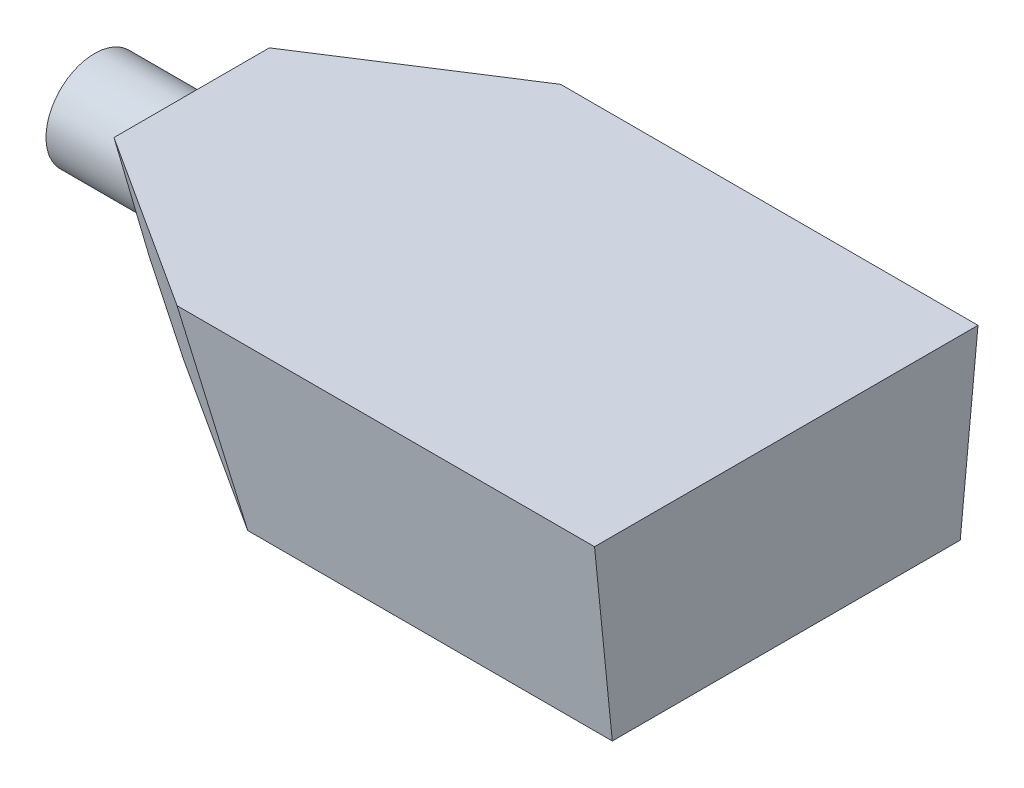
ISO-10303-21;
HEADER;
FILE_DESCRIPTION(('STEP AP214'),'2;1');
FILE_NAME('part.step','',(''),(''),'','','');
FILE_SCHEMA(('AUTOMOTIVE_DESIGN { 1 0 10303 214 1 1 1 1 }'));
ENDSEC;
DATA;
#1=APPLICATION_CONTEXT('core data for automotive mechanical design processes');
#2=APPLICATION_PROTOCOL_DEFINITION('international standard','automotive_design',2000,#1);
#3=PRODUCT_CONTEXT('',#1,'mechanical');
#4=PRODUCT('Part','Part','',(#3));
#5=PRODUCT_RELATED_PRODUCT_CATEGORY('part','',(#4));
#6=PRODUCT_DEFINITION_FORMATION('','',#4);
#7=PRODUCT_DEFINITION_CONTEXT('part definition',#1,'design');
#8=PRODUCT_DEFINITION('design','',#6,#7);
#9=PRODUCT_DEFINITION_SHAPE('','',#8);
#10=(LENGTH_UNIT() NAMED_UNIT(*) SI_UNIT(.MILLI.,.METRE.));
#11=(NAMED_UNIT(*) PLANE_ANGLE_UNIT() SI_UNIT($,.RADIAN.));
#12=(NAMED_UNIT(*) SI_UNIT($,.STERADIAN.) SOLID_ANGLE_UNIT());
#13=UNCERTAINTY_MEASURE_WITH_UNIT(LENGTH_MEASURE(1.E-05),#10,'distance_accuracy_value','');
#14=(GEOMETRIC_REPRESENTATION_CONTEXT(3) GLOBAL_UNCERTAINTY_ASSIGNED_CONTEXT((#13)) GLOBAL_UNIT_ASSIGNED_CONTEXT((#10,
#11,#12)) REPRESENTATION_CONTEXT('',''));
#15=CARTESIAN_POINT('',(0.,0.,0.));
#16=DIRECTION('',(0.,0.,1.));
#17=DIRECTION('',(1.,0.,0.));
#18=AXIS2_PLACEMENT_3D('',#15,#16,#17);
#19=CARTESIAN_POINT('',(-79.5,36.5,0.));
#20=DIRECTION('',(1.,0.,0.));
#21=DIRECTION('',(0.,0.,-1.));
#22=AXIS2_PLACEMENT_3D('',#19,#20,#21);
#23=PLANE('',#22);
#24=CARTESIAN_POINT('',(-79.5,23.5,0.));
#25=DIRECTION('',(-1.,0.,0.));
#26=DIRECTION('',(0.,0.,1.));
#27=AXIS2_PLACEMENT_3D('',#24,#25,#26);
#28=CIRCLE('',#27,10.);
#29=CARTESIAN_POINT('',(-79.5,23.5,10.));
#30=VERTEX_POINT('',#29);
#31=EDGE_CURVE('E11',#30,#30,#28,.T.);
#32=ORIENTED_EDGE('',*,*,#31,.F.);
#33=EDGE_LOOP('',(#32));
#34=FACE_BOUND('',#33,.T.);
#35=DIRECTION('',(0.,0.804868285259816,-0.593453488811822));
#36=VECTOR('',#35,1.);
#37=CARTESIAN_POINT('',(-79.5,23.5461292389051,-17.5686215407282));
#38=LINE('',#37,#36);
#39=CARTESIAN_POINT('',(-79.5,6.50000000000001,-5.00000000000007));
#40=VERTEX_POINT('',#39);
#41=CARTESIAN_POINT('',(-79.5,11.4999999999999,-8.6866497269193));
#42=VERTEX_POINT('',#41);
#43=EDGE_CURVE('E56',#40,#42,#38,.T.);
#44=ORIENTED_EDGE('',*,*,#43,.F.);
#45=DIRECTION('',(0.,0.,-1.));
#46=VECTOR('',#45,1.);
#47=CARTESIAN_POINT('',(-79.5,6.5,0.));
#48=LINE('',#47,#46);
#49=CARTESIAN_POINT('',(-79.5,6.5,5.00000000000008));
#50=VERTEX_POINT('',#49);
#51=EDGE_CURVE('E118',#50,#40,#48,.T.);
#52=ORIENTED_EDGE('',*,*,#51,.F.);
#53=DIRECTION('',(0.,-0.804868285259815,-0.593453488811823));
#54=VECTOR('',#53,1.);
#55=CARTESIAN_POINT('',(-79.5,23.5461292389051,17.5686215407283));
#56=LINE('',#55,#54);
#57=CARTESIAN_POINT('',(-79.5,11.4999999999999,8.6866497269193));
#58=VERTEX_POINT('',#57);
#59=EDGE_CURVE('E64',#58,#50,#56,.T.);
#60=ORIENTED_EDGE('',*,*,#59,.F.);
#61=DIRECTION('',(0.,0.959775929235968,0.280767102166964));
#62=VECTOR('',#61,1.);
#63=CARTESIAN_POINT('',(-79.5,32.188423897901,14.7387173494522));
#64=LINE('',#63,#62);
#65=CARTESIAN_POINT('',(-79.5,36.5,16.));
#66=VERTEX_POINT('',#65);
#67=EDGE_CURVE('E147',#58,#66,#64,.T.);
#68=ORIENTED_EDGE('',*,*,#67,.T.);
#69=DIRECTION('',(0.,0.,1.));
#70=VECTOR('',#69,1.);
#71=CARTESIAN_POINT('',(-79.5,36.5,0.));
#72=LINE('',#71,#70);
#73=CARTESIAN_POINT('',(-79.5,36.5,-16.));
#74=VERTEX_POINT('',#73);
#75=EDGE_CURVE('E150',#74,#66,#72,.T.);
#76=ORIENTED_EDGE('',*,*,#75,.F.);
#77=DIRECTION('',(0.,-0.959775929235968,0.280767102166964));
#78=VECTOR('',#77,1.);
#79=CARTESIAN_POINT('',(-79.5,32.188423897901,-14.7387173494522));
#80=LINE('',#79,#78);
#81=EDGE_CURVE('E136',#74,#42,#80,.T.);
#82=ORIENTED_EDGE('',*,*,#81,.T.);
#83=EDGE_LOOP('',(#44,#52,#60,#68,#76,#82));
#84=FACE_BOUND('',#83,.T.);
#85=ADVANCED_FACE('F41',(#34,#84),#23,.F.);
#86=CARTESIAN_POINT('',(-18.267826798414,-30.3526968342879,0.));
#87=DIRECTION('',(-0.515661935203639,-0.8567921384922,0.));
#88=DIRECTION('',(0.8567921384922,-0.515661935203639,0.));
#89=AXIS2_PLACEMENT_3D('',#86,#87,#88);
#90=PLANE('',#89);
#91=ORIENTED_EDGE('',*,*,#51,.T.);
#92=DIRECTION('',(0.742046015709188,-0.446601768713863,-0.499914563452365));
#93=VECTOR('',#92,1.);
#94=CARTESIAN_POINT('',(-35.4254371303105,-20.0263572826835,-34.6929238752086));
#95=LINE('',#94,#93);
#96=CARTESIAN_POINT('',(-68.7000000000001,0.,-12.2759332588364));
#97=VERTEX_POINT('',#96);
#98=EDGE_CURVE('E105',#40,#97,#95,.T.);
#99=ORIENTED_EDGE('',*,*,#98,.T.);
#100=DIRECTION('',(0.,0.,1.));
#101=VECTOR('',#100,1.);
#102=CARTESIAN_POINT('',(-68.7,0.,0.));
#103=LINE('',#102,#101);
#104=CARTESIAN_POINT('',(-68.7,0.,12.2759332588365));
#105=VERTEX_POINT('',#104);
#106=EDGE_CURVE('E115',#97,#105,#103,.T.);
#107=ORIENTED_EDGE('',*,*,#106,.T.);
#108=DIRECTION('',(-0.742046015709188,0.446601768713863,-0.499914563452365));
#109=VECTOR('',#108,1.);
#110=CARTESIAN_POINT('',(-35.4254371303105,-20.0263572826835,34.6929238752086));
#111=LINE('',#110,#109);
#112=EDGE_CURVE('E109',#105,#50,#111,.T.);
#113=ORIENTED_EDGE('',*,*,#112,.T.);
#114=EDGE_LOOP('',(#91,#99,#107,#113));
#115=FACE_BOUND('',#114,.T.);
#116=ADVANCED_FACE('F114',(#115),#90,.T.);
#117=CARTESIAN_POINT('',(-24.2527109239655,-11.0194941398189,-37.6691042010528));
#118=DIRECTION('',(0.525671978801562,0.238845022646387,0.816469243670512));
#119=DIRECTION('',(-0.840804047330232,0.,0.541339592116724));
#120=AXIS2_PLACEMENT_3D('',#117,#118,#119);
#121=PLANE('',#120);
#122=DIRECTION('',(0.667515518462053,-0.710780413177184,-0.221842820158796));
#123=VECTOR('',#122,1.);
#124=CARTESIAN_POINT('',(-39.9067258115172,-30.6595049229215,-21.8451207472343));
#125=LINE('',#124,#123);
#126=EDGE_CURVE('E44',#42,#97,#125,.T.);
#127=ORIENTED_EDGE('',*,*,#126,.F.);
#128=ORIENTED_EDGE('',*,*,#81,.F.);
#129=DIRECTION('',(0.840804047330232,0.,-0.541339592116724));
#130=VECTOR('',#129,1.);
#131=CARTESIAN_POINT('',(-30.579928362961,36.5,-47.4964844786416));
#132=LINE('',#131,#130);
#133=CARTESIAN_POINT('',(-43.,36.5,-39.5));
#134=VERTEX_POINT('',#133);
#135=EDGE_CURVE('E164',#74,#134,#132,.T.);
#136=ORIENTED_EDGE('',*,*,#135,.T.);
#137=DIRECTION('',(-0.284831972389815,0.953795136901675,-0.0956325484719649));
#138=VECTOR('',#137,1.);
#139=CARTESIAN_POINT('',(-32.1,0.,-35.8403168204803));
#140=LINE('',#139,#138);
#141=CARTESIAN_POINT('',(-32.1,0.,-35.8403168204803));
#142=VERTEX_POINT('',#141);
#143=EDGE_CURVE('E134',#142,#134,#140,.T.);
#144=ORIENTED_EDGE('',*,*,#143,.F.);
#145=DIRECTION('',(0.840804047330232,0.,-0.541339592116724));
#146=VECTOR('',#145,1.);
#147=CARTESIAN_POINT('',(-25.7199558252942,0.,-39.9480164946059));
#148=LINE('',#147,#146);
#149=EDGE_CURVE('E124',#97,#142,#148,.T.);
#150=ORIENTED_EDGE('',*,*,#149,.F.);
#151=EDGE_LOOP('',(#127,#128,#136,#144,#150));
#152=FACE_BOUND('',#151,.T.);
#153=ADVANCED_FACE('F132',(#152),#121,.F.);
#154=CARTESIAN_POINT('',(-24.2527109239655,-11.0194941398189,37.6691042010528));
#155=DIRECTION('',(0.525671978801562,0.238845022646387,-0.816469243670512));
#156=DIRECTION('',(-0.840804047330232,0.,-0.541339592116724));
#157=AXIS2_PLACEMENT_3D('',#154,#155,#156);
#158=PLANE('',#157);
#159=DIRECTION('',(-0.667515518462053,0.710780413177184,-0.221842820158796));
#160=VECTOR('',#159,1.);
#161=CARTESIAN_POINT('',(-39.9067258115172,-30.6595049229215,21.8451207472343));
#162=LINE('',#161,#160);
#163=EDGE_CURVE('E172',#105,#58,#162,.T.);
#164=ORIENTED_EDGE('',*,*,#163,.F.);
#165=DIRECTION('',(-0.840804047330232,0.,-0.541339592116724));
#166=VECTOR('',#165,1.);
#167=CARTESIAN_POINT('',(-25.7199558252942,0.,39.9480164946059));
#168=LINE('',#167,#166);
#169=CARTESIAN_POINT('',(-32.1,0.,35.8403168204803));
#170=VERTEX_POINT('',#169);
#171=EDGE_CURVE('E128',#170,#105,#168,.T.);
#172=ORIENTED_EDGE('',*,*,#171,.F.);
#173=DIRECTION('',(-0.284831972389815,0.953795136901675,0.0956325484719649));
#174=VECTOR('',#173,1.);
#175=CARTESIAN_POINT('',(-32.1,0.,35.8403168204803));
#176=LINE('',#175,#174);
#177=CARTESIAN_POINT('',(-43.,36.5,39.5));
#178=VERTEX_POINT('',#177);
#179=EDGE_CURVE('E144',#170,#178,#176,.T.);
#180=ORIENTED_EDGE('',*,*,#179,.T.);
#181=DIRECTION('',(0.840804047330232,0.,0.541339592116724));
#182=VECTOR('',#181,1.);
#183=CARTESIAN_POINT('',(-30.579928362961,36.5,47.4964844786415));
#184=LINE('',#183,#182);
#185=EDGE_CURVE('E153',#66,#178,#184,.T.);
#186=ORIENTED_EDGE('',*,*,#185,.F.);
#187=ORIENTED_EDGE('',*,*,#67,.F.);
#188=EDGE_LOOP('',(#164,#172,#180,#186,#187));
#189=FACE_BOUND('',#188,.T.);
#190=ADVANCED_FACE('F193',(#189),#158,.F.);
#191=CARTESIAN_POINT('',(0.,0.,0.));
#192=DIRECTION('',(0.,1.,0.));
#193=DIRECTION('',(0.,0.,1.));
#194=AXIS2_PLACEMENT_3D('',#191,#192,#193);
#195=PLANE('',#194);
#196=ORIENTED_EDGE('',*,*,#106,.F.);
#197=ORIENTED_EDGE('',*,*,#149,.T.);
#198=DIRECTION('',(-1.,0.,0.));
#199=VECTOR('',#198,1.);
#200=CARTESIAN_POINT('',(0.,0.,-35.8403168204803));
#201=LINE('',#200,#199);
#202=CARTESIAN_POINT('',(43.,0.,-35.8403168204803));
#203=VERTEX_POINT('',#202);
#204=EDGE_CURVE('E178',#203,#142,#201,.T.);
#205=ORIENTED_EDGE('',*,*,#204,.F.);
#206=DIRECTION('',(0.,0.,-1.));
#207=VECTOR('',#206,1.);
#208=CARTESIAN_POINT('',(43.,0.,0.));
#209=LINE('',#208,#207);
#210=CARTESIAN_POINT('',(43.,0.,35.8403168204803));
#211=VERTEX_POINT('',#210);
#212=EDGE_CURVE('E149',#211,#203,#209,.T.);
#213=ORIENTED_EDGE('',*,*,#212,.F.);
#214=DIRECTION('',(1.,0.,0.));
#215=VECTOR('',#214,1.);
#216=CARTESIAN_POINT('',(0.,0.,35.8403168204803));
#217=LINE('',#216,#215);
#218=EDGE_CURVE('E138',#170,#211,#217,.T.);
#219=ORIENTED_EDGE('',*,*,#218,.F.);
#220=ORIENTED_EDGE('',*,*,#171,.T.);
#221=EDGE_LOOP('',(#196,#197,#205,#213,#219,#220));
#222=FACE_BOUND('',#221,.T.);
#223=ADVANCED_FACE('F122',(#222),#195,.F.);
#224=CARTESIAN_POINT('',(43.,36.5,0.));
#225=DIRECTION('',(-1.,0.,0.));
#226=DIRECTION('',(0.,0.,1.));
#227=AXIS2_PLACEMENT_3D('',#224,#225,#226);
#228=PLANE('',#227);
#229=DIRECTION('',(0.,0.99501102033677,-0.0997650710839227));
#230=VECTOR('',#229,1.);
#231=CARTESIAN_POINT('',(43.,0.,-35.8403168204803));
#232=LINE('',#231,#230);
#233=CARTESIAN_POINT('',(43.,36.5,-39.5));
#234=VERTEX_POINT('',#233);
#235=EDGE_CURVE('E129',#203,#234,#232,.T.);
#236=ORIENTED_EDGE('',*,*,#235,.T.);
#237=DIRECTION('',(0.,0.,-1.));
#238=VECTOR('',#237,1.);
#239=CARTESIAN_POINT('',(43.,36.5,0.));
#240=LINE('',#239,#238);
#241=CARTESIAN_POINT('',(43.,36.5,39.5));
#242=VERTEX_POINT('',#241);
#243=EDGE_CURVE('E159',#242,#234,#240,.T.);
#244=ORIENTED_EDGE('',*,*,#243,.F.);
#245=DIRECTION('',(0.,0.99501102033677,0.0997650710839227));
#246=VECTOR('',#245,1.);
#247=CARTESIAN_POINT('',(43.,0.,35.8403168204803));
#248=LINE('',#247,#246);
#249=EDGE_CURVE('E135',#211,#242,#248,.T.);
#250=ORIENTED_EDGE('',*,*,#249,.F.);
#251=ORIENTED_EDGE('',*,*,#212,.T.);
#252=EDGE_LOOP('',(#236,#244,#250,#251));
#253=FACE_BOUND('',#252,.T.);
#254=ADVANCED_FACE('F189',(#253),#228,.F.);
#255=CARTESIAN_POINT('',(0.,36.5,0.));
#256=DIRECTION('',(0.,1.,0.));
#257=DIRECTION('',(0.,0.,1.));
#258=AXIS2_PLACEMENT_3D('',#255,#256,#257);
#259=PLANE('',#258);
#260=ORIENTED_EDGE('',*,*,#75,.T.);
#261=ORIENTED_EDGE('',*,*,#185,.T.);
#262=DIRECTION('',(1.,0.,0.));
#263=VECTOR('',#262,1.);
#264=CARTESIAN_POINT('',(0.,36.5,39.5));
#265=LINE('',#264,#263);
#266=EDGE_CURVE('E156',#178,#242,#265,.T.);
#267=ORIENTED_EDGE('',*,*,#266,.T.);
#268=ORIENTED_EDGE('',*,*,#243,.T.);
#269=DIRECTION('',(1.,0.,0.));
#270=VECTOR('',#269,1.);
#271=CARTESIAN_POINT('',(0.,36.5,-39.5));
#272=LINE('',#271,#270);
#273=EDGE_CURVE('E162',#134,#234,#272,.T.);
#274=ORIENTED_EDGE('',*,*,#273,.F.);
#275=ORIENTED_EDGE('',*,*,#135,.F.);
#276=EDGE_LOOP('',(#260,#261,#267,#268,#274,#275));
#277=FACE_BOUND('',#276,.T.);
#278=ADVANCED_FACE('F185',(#277),#259,.T.);
#279=CARTESIAN_POINT('',(0.,-3.55777310093491,35.4835956595478));
#280=DIRECTION('',(0.,-0.0997650710839228,0.99501102033677));
#281=DIRECTION('',(0.,-0.99501102033677,-0.0997650710839228));
#282=AXIS2_PLACEMENT_3D('',#279,#280,#281);
#283=PLANE('',#282);
#284=ORIENTED_EDGE('',*,*,#218,.T.);
#285=ORIENTED_EDGE('',*,*,#249,.T.);
#286=ORIENTED_EDGE('',*,*,#266,.F.);
#287=ORIENTED_EDGE('',*,*,#179,.F.);
#288=EDGE_LOOP('',(#284,#285,#286,#287));
#289=FACE_BOUND('',#288,.T.);
#290=ADVANCED_FACE('F242',(#289),#283,.T.);
#291=CARTESIAN_POINT('',(0.,-3.55777310093491,-35.4835956595478));
#292=DIRECTION('',(0.,-0.0997650710839228,-0.99501102033677));
#293=DIRECTION('',(0.,-0.99501102033677,0.0997650710839228));
#294=AXIS2_PLACEMENT_3D('',#291,#292,#293);
#295=PLANE('',#294);
#296=ORIENTED_EDGE('',*,*,#204,.T.);
#297=ORIENTED_EDGE('',*,*,#143,.T.);
#298=ORIENTED_EDGE('',*,*,#273,.T.);
#299=ORIENTED_EDGE('',*,*,#235,.F.);
#300=EDGE_LOOP('',(#296,#297,#298,#299));
#301=FACE_BOUND('',#300,.T.);
#302=ADVANCED_FACE('F180',(#301),#295,.T.);
#303=CARTESIAN_POINT('',(-35.6345001380475,-23.5125753754337,31.8888111389437));
#304=DIRECTION('',(-0.668721863920557,-0.441240179312758,0.598429756007053));
#305=DIRECTION('',(0.666856540186785,0.,0.745186120918869));
#306=AXIS2_PLACEMENT_3D('',#303,#304,#305);
#307=PLANE('',#306);
#308=ORIENTED_EDGE('',*,*,#59,.T.);
#309=ORIENTED_EDGE('',*,*,#112,.F.);
#310=ORIENTED_EDGE('',*,*,#163,.T.);
#311=EDGE_LOOP('',(#308,#309,#310));
#312=FACE_BOUND('',#311,.T.);
#313=ADVANCED_FACE('F239',(#312),#307,.T.);
#314=CARTESIAN_POINT('',(-35.6345001380475,-23.5125753754337,-31.8888111389437));
#315=DIRECTION('',(-0.668721863920557,-0.441240179312758,-0.598429756007053));
#316=DIRECTION('',(0.666856540186785,0.,-0.745186120918869));
#317=AXIS2_PLACEMENT_3D('',#314,#315,#316);
#318=PLANE('',#317);
#319=ORIENTED_EDGE('',*,*,#43,.T.);
#320=ORIENTED_EDGE('',*,*,#126,.T.);
#321=ORIENTED_EDGE('',*,*,#98,.F.);
#322=EDGE_LOOP('',(#319,#320,#321));
#323=FACE_BOUND('',#322,.T.);
#324=ADVANCED_FACE('F104',(#323),#318,.T.);
#325=CARTESIAN_POINT('',(-99.5,23.5,0.));
#326=DIRECTION('',(1.,0.,0.));
#327=DIRECTION('',(0.,0.,-1.));
#328=AXIS2_PLACEMENT_3D('',#325,#326,#327);
#329=CYLINDRICAL_SURFACE('',#328,10.);
#330=CARTESIAN_POINT('',(-99.5,23.5,0.));
#331=DIRECTION('',(-1.,0.,0.));
#332=DIRECTION('',(0.,0.,1.));
#333=AXIS2_PLACEMENT_3D('',#330,#331,#332);
#334=CIRCLE('',#333,10.);
#335=CARTESIAN_POINT('',(-99.5,23.5,10.));
#336=VERTEX_POINT('',#335);
#337=EDGE_CURVE('E119',#336,#336,#334,.T.);
#338=ORIENTED_EDGE('',*,*,#337,.F.);
#339=EDGE_LOOP('',(#338));
#340=FACE_BOUND('',#339,.T.);
#341=ORIENTED_EDGE('',*,*,#31,.T.);
#342=EDGE_LOOP('',(#341));
#343=FACE_BOUND('',#342,.T.);
#344=ADVANCED_FACE('F217',(#340,#343),#329,.T.);
#345=CARTESIAN_POINT('',(-99.5,0.,0.));
#346=DIRECTION('',(-1.,0.,0.));
#347=DIRECTION('',(0.,0.,1.));
#348=AXIS2_PLACEMENT_3D('',#345,#346,#347);
#349=PLANE('',#348);
#350=CARTESIAN_POINT('',(-99.5,23.5,0.));
#351=DIRECTION('',(-1.,0.,0.));
#352=DIRECTION('',(0.,0.,1.));
#353=AXIS2_PLACEMENT_3D('',#350,#351,#352);
#354=CIRCLE('',#353,9.1);
#355=CARTESIAN_POINT('',(-99.5,23.5,9.10000000000005));
#356=VERTEX_POINT('',#355);
#357=EDGE_CURVE('E200',#356,#356,#354,.T.);
#358=ORIENTED_EDGE('',*,*,#357,.F.);
#359=EDGE_LOOP('',(#358));
#360=FACE_BOUND('',#359,.T.);
#361=ORIENTED_EDGE('',*,*,#337,.T.);
#362=EDGE_LOOP('',(#361));
#363=FACE_BOUND('',#362,.T.);
#364=ADVANCED_FACE('F211',(#360,#363),#349,.T.);
#365=CARTESIAN_POINT('',(-79.5,23.5,0.));
#366=DIRECTION('',(-1.,0.,0.));
#367=DIRECTION('',(0.,0.,1.));
#368=AXIS2_PLACEMENT_3D('',#365,#366,#367);
#369=CYLINDRICAL_SURFACE('',#368,9.1);
#370=CARTESIAN_POINT('',(-79.5,23.5,0.));
#371=DIRECTION('',(-1.,0.,0.));
#372=DIRECTION('',(0.,0.,1.));
#373=AXIS2_PLACEMENT_3D('',#370,#371,#372);
#374=CIRCLE('',#373,9.1);
#375=CARTESIAN_POINT('',(-79.5,23.5,9.10000000000004));
#376=VERTEX_POINT('',#375);
#377=EDGE_CURVE('E199',#376,#376,#374,.T.);
#378=ORIENTED_EDGE('',*,*,#377,.F.);
#379=EDGE_LOOP('',(#378));
#380=FACE_BOUND('',#379,.T.);
#381=ORIENTED_EDGE('',*,*,#357,.T.);
#382=EDGE_LOOP('',(#381));
#383=FACE_BOUND('',#382,.T.);
#384=ADVANCED_FACE('F208',(#380,#383),#369,.F.);
#385=CARTESIAN_POINT('',(-79.5,23.5,0.));
#386=DIRECTION('',(-1.,0.,0.));
#387=DIRECTION('',(0.,0.,1.));
#388=AXIS2_PLACEMENT_3D('',#385,#386,#387);
#389=PLANE('',#388);
#390=ORIENTED_EDGE('',*,*,#377,.T.);
#391=EDGE_LOOP('',(#390));
#392=FACE_BOUND('',#391,.T.);
#393=ADVANCED_FACE('F206',(#392),#389,.T.);
#394=CLOSED_SHELL('',(#85,#116,#153,#190,#223,#254,#278,#290,#302,#313,#324,#344,#364,#384,#393));
#395=MANIFOLD_SOLID_BREP('B2',#394);
#396=ADVANCED_BREP_SHAPE_REPRESENTATION('',(#18,#395),#14);
#397=SHAPE_DEFINITION_REPRESENTATION(#9,#396);
ENDSEC;
END-ISO-10303-21;
